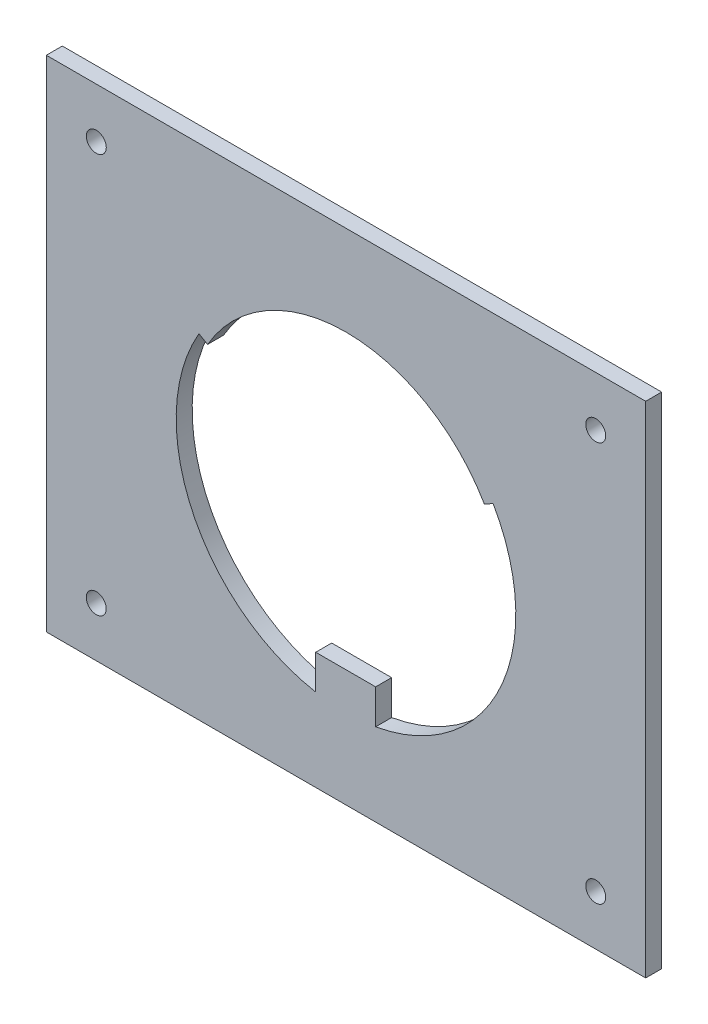
ISO-10303-21;
HEADER;
FILE_DESCRIPTION(('STEP AP214'),'2;1');
FILE_NAME('part.step','',(''),(''),'','','');
FILE_SCHEMA(('AUTOMOTIVE_DESIGN { 1 0 10303 214 1 1 1 1 }'));
ENDSEC;
DATA;
#1=APPLICATION_CONTEXT('core data for automotive mechanical design processes');
#2=APPLICATION_PROTOCOL_DEFINITION('international standard','automotive_design',2000,#1);
#3=PRODUCT_CONTEXT('',#1,'mechanical');
#4=PRODUCT('Part','Part','',(#3));
#5=PRODUCT_RELATED_PRODUCT_CATEGORY('part','',(#4));
#6=PRODUCT_DEFINITION_FORMATION('','',#4);
#7=PRODUCT_DEFINITION_CONTEXT('part definition',#1,'design');
#8=PRODUCT_DEFINITION('design','',#6,#7);
#9=PRODUCT_DEFINITION_SHAPE('','',#8);
#10=(LENGTH_UNIT() NAMED_UNIT(*) SI_UNIT(.MILLI.,.METRE.));
#11=(NAMED_UNIT(*) PLANE_ANGLE_UNIT() SI_UNIT($,.RADIAN.));
#12=(NAMED_UNIT(*) SI_UNIT($,.STERADIAN.) SOLID_ANGLE_UNIT());
#13=UNCERTAINTY_MEASURE_WITH_UNIT(LENGTH_MEASURE(1.E-05),#10,'distance_accuracy_value','');
#14=(GEOMETRIC_REPRESENTATION_CONTEXT(3) GLOBAL_UNCERTAINTY_ASSIGNED_CONTEXT((#13)) GLOBAL_UNIT_ASSIGNED_CONTEXT((#10,
#11,#12)) REPRESENTATION_CONTEXT('',''));
#15=CARTESIAN_POINT('',(0.,0.,0.));
#16=DIRECTION('',(0.,0.,1.));
#17=DIRECTION('',(1.,0.,0.));
#18=AXIS2_PLACEMENT_3D('',#15,#16,#17);
#19=CARTESIAN_POINT('',(0.,0.,1.6));
#20=DIRECTION('',(0.,0.,1.));
#21=DIRECTION('',(1.,0.,0.));
#22=AXIS2_PLACEMENT_3D('',#19,#20,#21);
#23=PLANE('',#22);
#24=CARTESIAN_POINT('',(27.1836166538104,-19.4518427269383,1.6));
#25=DIRECTION('',(0.,0.,1.));
#26=DIRECTION('',(1.,0.,0.));
#27=AXIS2_PLACEMENT_3D('',#24,#25,#26);
#28=CIRCLE('',#27,1.);
#29=CARTESIAN_POINT('',(28.1836166538105,-19.4518427269383,1.6));
#30=VERTEX_POINT('',#29);
#31=EDGE_CURVE('E313',#30,#30,#28,.T.);
#32=ORIENTED_EDGE('',*,*,#31,.F.);
#33=EDGE_LOOP('',(#32));
#34=FACE_BOUND('',#33,.T.);
#35=CARTESIAN_POINT('',(-22.8163833461895,20.5481572730617,1.6));
#36=DIRECTION('',(0.,0.,1.));
#37=DIRECTION('',(1.,0.,0.));
#38=AXIS2_PLACEMENT_3D('',#35,#36,#37);
#39=CIRCLE('',#38,1.);
#40=CARTESIAN_POINT('',(-21.8163833461895,20.5481572730617,1.6));
#41=VERTEX_POINT('',#40);
#42=EDGE_CURVE('E159',#41,#41,#39,.T.);
#43=ORIENTED_EDGE('',*,*,#42,.F.);
#44=EDGE_LOOP('',(#43));
#45=FACE_BOUND('',#44,.T.);
#46=DIRECTION('',(0.,1.,0.));
#47=VECTOR('',#46,1.);
#48=CARTESIAN_POINT('',(32.1836166538104,25.5481572730617,1.6));
#49=LINE('',#48,#47);
#50=CARTESIAN_POINT('',(32.1836166538104,-24.4518427269383,1.6));
#51=VERTEX_POINT('',#50);
#52=CARTESIAN_POINT('',(32.1836166538104,25.5481572730617,1.6));
#53=VERTEX_POINT('',#52);
#54=EDGE_CURVE('E189',#51,#53,#49,.T.);
#55=ORIENTED_EDGE('',*,*,#54,.T.);
#56=DIRECTION('',(-1.,0.,0.));
#57=VECTOR('',#56,1.);
#58=CARTESIAN_POINT('',(-27.8163833461895,25.5481572730617,1.6));
#59=LINE('',#58,#57);
#60=CARTESIAN_POINT('',(-27.8163833461895,25.5481572730617,1.6));
#61=VERTEX_POINT('',#60);
#62=EDGE_CURVE('E192',#53,#61,#59,.T.);
#63=ORIENTED_EDGE('',*,*,#62,.T.);
#64=DIRECTION('',(0.,-1.,0.));
#65=VECTOR('',#64,1.);
#66=CARTESIAN_POINT('',(-27.8163833461895,25.5481572730617,1.6));
#67=LINE('',#66,#65);
#68=CARTESIAN_POINT('',(-27.8163833461895,-24.4518427269383,1.6));
#69=VERTEX_POINT('',#68);
#70=EDGE_CURVE('E195',#61,#69,#67,.T.);
#71=ORIENTED_EDGE('',*,*,#70,.T.);
#72=DIRECTION('',(1.,0.,0.));
#73=VECTOR('',#72,1.);
#74=CARTESIAN_POINT('',(-27.8163833461895,-24.4518427269383,1.6));
#75=LINE('',#74,#73);
#76=EDGE_CURVE('E197',#69,#51,#75,.T.);
#77=ORIENTED_EDGE('',*,*,#76,.T.);
#78=EDGE_LOOP('',(#55,#63,#71,#77));
#79=FACE_BOUND('',#78,.T.);
#80=CARTESIAN_POINT('',(2.18361665381047,0.548157273061697,1.6));
#81=DIRECTION('',(0.,0.,1.));
#82=DIRECTION('',(1.,0.,0.));
#83=AXIS2_PLACEMENT_3D('',#80,#81,#82);
#84=CIRCLE('',#83,17.);
#85=CARTESIAN_POINT('',(5.15036070411573,-16.1909714300691,1.6));
#86=VERTEX_POINT('',#85);
#87=CARTESIAN_POINT('',(16.9060485181459,9.04815727306167,1.6));
#88=VERTEX_POINT('',#87);
#89=EDGE_CURVE('E129',#86,#88,#84,.T.);
#90=ORIENTED_EDGE('',*,*,#89,.F.);
#91=DIRECTION('',(0.,-1.,0.));
#92=VECTOR('',#91,1.);
#93=CARTESIAN_POINT('',(5.15036070411573,-12.7268427269383,1.6));
#94=LINE('',#93,#92);
#95=CARTESIAN_POINT('',(5.15036070411573,-12.7268427269383,1.6));
#96=VERTEX_POINT('',#95);
#97=EDGE_CURVE('E121',#96,#86,#94,.T.);
#98=ORIENTED_EDGE('',*,*,#97,.F.);
#99=DIRECTION('',(1.,0.,0.));
#100=VECTOR('',#99,1.);
#101=CARTESIAN_POINT('',(-0.84963929588427,-12.7268427269383,1.6));
#102=LINE('',#101,#100);
#103=CARTESIAN_POINT('',(-0.84963929588427,-12.7268427269383,1.6));
#104=VERTEX_POINT('',#103);
#105=EDGE_CURVE('E156',#104,#96,#102,.T.);
#106=ORIENTED_EDGE('',*,*,#105,.F.);
#107=DIRECTION('',(0.,1.,0.));
#108=VECTOR('',#107,1.);
#109=CARTESIAN_POINT('',(-0.84963929588427,-12.7268427269383,1.6));
#110=LINE('',#109,#108);
#111=CARTESIAN_POINT('',(-0.84963929588427,-16.1790468670103,1.6));
#112=VERTEX_POINT('',#111);
#113=EDGE_CURVE('E154',#112,#104,#110,.T.);
#114=ORIENTED_EDGE('',*,*,#113,.F.);
#115=CARTESIAN_POINT('',(2.18361665381047,0.548157273061699,1.6));
#116=DIRECTION('',(0.,0.,1.));
#117=DIRECTION('',(1.,0.,0.));
#118=AXIS2_PLACEMENT_3D('',#115,#116,#117);
#119=CIRCLE('',#118,17.);
#120=CARTESIAN_POINT('',(-12.538815210525,9.04815727306166,1.6));
#121=VERTEX_POINT('',#120);
#122=EDGE_CURVE('E152',#121,#112,#119,.T.);
#123=ORIENTED_EDGE('',*,*,#122,.F.);
#124=DIRECTION('',(-0.866025403784439,0.499999999999999,0.));
#125=VECTOR('',#124,1.);
#126=CARTESIAN_POINT('',(-11.6727898067406,8.54815727306167,1.6));
#127=LINE('',#126,#125);
#128=CARTESIAN_POINT('',(-11.6727898067406,8.54815727306167,1.6));
#129=VERTEX_POINT('',#128);
#130=EDGE_CURVE('E150',#129,#121,#127,.T.);
#131=ORIENTED_EDGE('',*,*,#130,.F.);
#132=CARTESIAN_POINT('',(2.18361665381045,0.548157273061695,1.6));
#133=DIRECTION('',(0.,0.,1.));
#134=DIRECTION('',(1.,0.,0.));
#135=AXIS2_PLACEMENT_3D('',#132,#133,#134);
#136=CIRCLE('',#135,16.);
#137=CARTESIAN_POINT('',(16.0400231143615,8.54815727306166,1.6));
#138=VERTEX_POINT('',#137);
#139=EDGE_CURVE('E145',#138,#129,#136,.T.);
#140=ORIENTED_EDGE('',*,*,#139,.F.);
#141=DIRECTION('',(-0.866025403784438,-0.500000000000002,0.));
#142=VECTOR('',#141,1.);
#143=CARTESIAN_POINT('',(16.9060485181459,9.04815727306167,1.6));
#144=LINE('',#143,#142);
#145=EDGE_CURVE('E143',#88,#138,#144,.T.);
#146=ORIENTED_EDGE('',*,*,#145,.F.);
#147=EDGE_LOOP('',(#90,#98,#106,#114,#123,#131,#140,#146));
#148=FACE_BOUND('',#147,.T.);
#149=CARTESIAN_POINT('',(27.1836166538104,20.5481572730617,1.6));
#150=DIRECTION('',(0.,0.,1.));
#151=DIRECTION('',(-1.,0.,0.));
#152=AXIS2_PLACEMENT_3D('',#149,#150,#151);
#153=CIRCLE('',#152,1.);
#154=CARTESIAN_POINT('',(26.1836166538104,20.5481572730617,1.6));
#155=VERTEX_POINT('',#154);
#156=EDGE_CURVE('E319',#155,#155,#153,.T.);
#157=ORIENTED_EDGE('',*,*,#156,.F.);
#158=EDGE_LOOP('',(#157));
#159=FACE_BOUND('',#158,.T.);
#160=CARTESIAN_POINT('',(-22.8163833461895,-19.4518427269383,1.6));
#161=DIRECTION('',(0.,0.,1.));
#162=DIRECTION('',(-1.,0.,0.));
#163=AXIS2_PLACEMENT_3D('',#160,#161,#162);
#164=CIRCLE('',#163,1.);
#165=CARTESIAN_POINT('',(-23.8163833461895,-19.4518427269383,1.6));
#166=VERTEX_POINT('',#165);
#167=EDGE_CURVE('E304',#166,#166,#164,.T.);
#168=ORIENTED_EDGE('',*,*,#167,.F.);
#169=EDGE_LOOP('',(#168));
#170=FACE_BOUND('',#169,.T.);
#171=ADVANCED_FACE('F32',(#34,#45,#79,#148,#159,#170),#23,.T.);
#172=CARTESIAN_POINT('',(0.,0.,0.));
#173=DIRECTION('',(0.,0.,1.));
#174=DIRECTION('',(1.,0.,0.));
#175=AXIS2_PLACEMENT_3D('',#172,#173,#174);
#176=PLANE('',#175);
#177=DIRECTION('',(0.,1.,0.));
#178=VECTOR('',#177,1.);
#179=CARTESIAN_POINT('',(32.1836166538104,25.5481572730617,0.));
#180=LINE('',#179,#178);
#181=CARTESIAN_POINT('',(32.1836166538104,-24.4518427269383,0.));
#182=VERTEX_POINT('',#181);
#183=CARTESIAN_POINT('',(32.1836166538104,25.5481572730617,0.));
#184=VERTEX_POINT('',#183);
#185=EDGE_CURVE('E137',#182,#184,#180,.T.);
#186=ORIENTED_EDGE('',*,*,#185,.F.);
#187=DIRECTION('',(1.,0.,0.));
#188=VECTOR('',#187,1.);
#189=CARTESIAN_POINT('',(-27.8163833461895,-24.4518427269383,0.));
#190=LINE('',#189,#188);
#191=CARTESIAN_POINT('',(-27.8163833461895,-24.4518427269383,0.));
#192=VERTEX_POINT('',#191);
#193=EDGE_CURVE('E193',#192,#182,#190,.T.);
#194=ORIENTED_EDGE('',*,*,#193,.F.);
#195=DIRECTION('',(0.,-1.,0.));
#196=VECTOR('',#195,1.);
#197=CARTESIAN_POINT('',(-27.8163833461895,25.5481572730617,0.));
#198=LINE('',#197,#196);
#199=CARTESIAN_POINT('',(-27.8163833461895,25.5481572730617,0.));
#200=VERTEX_POINT('',#199);
#201=EDGE_CURVE('E204',#200,#192,#198,.T.);
#202=ORIENTED_EDGE('',*,*,#201,.F.);
#203=DIRECTION('',(-1.,0.,0.));
#204=VECTOR('',#203,1.);
#205=CARTESIAN_POINT('',(-27.8163833461895,25.5481572730617,0.));
#206=LINE('',#205,#204);
#207=EDGE_CURVE('E202',#184,#200,#206,.T.);
#208=ORIENTED_EDGE('',*,*,#207,.F.);
#209=EDGE_LOOP('',(#186,#194,#202,#208));
#210=FACE_BOUND('',#209,.T.);
#211=DIRECTION('',(0.,-1.,0.));
#212=VECTOR('',#211,1.);
#213=CARTESIAN_POINT('',(5.15036070411573,-12.7268427269383,0.));
#214=LINE('',#213,#212);
#215=CARTESIAN_POINT('',(5.15036070411573,-12.7268427269383,0.));
#216=VERTEX_POINT('',#215);
#217=CARTESIAN_POINT('',(5.15036070411573,-16.1909714300691,0.));
#218=VERTEX_POINT('',#217);
#219=EDGE_CURVE('E55',#216,#218,#214,.T.);
#220=ORIENTED_EDGE('',*,*,#219,.T.);
#221=CARTESIAN_POINT('',(2.18361665381047,0.548157273061697,0.));
#222=DIRECTION('',(0.,0.,1.));
#223=DIRECTION('',(1.,0.,0.));
#224=AXIS2_PLACEMENT_3D('',#221,#222,#223);
#225=CIRCLE('',#224,17.);
#226=CARTESIAN_POINT('',(16.9060485181459,9.04815727306167,0.));
#227=VERTEX_POINT('',#226);
#228=EDGE_CURVE('E136',#218,#227,#225,.T.);
#229=ORIENTED_EDGE('',*,*,#228,.T.);
#230=DIRECTION('',(-0.866025403784438,-0.500000000000002,0.));
#231=VECTOR('',#230,1.);
#232=CARTESIAN_POINT('',(16.9060485181459,9.04815727306167,0.));
#233=LINE('',#232,#231);
#234=CARTESIAN_POINT('',(16.0400231143615,8.54815727306166,0.));
#235=VERTEX_POINT('',#234);
#236=EDGE_CURVE('E161',#227,#235,#233,.T.);
#237=ORIENTED_EDGE('',*,*,#236,.T.);
#238=CARTESIAN_POINT('',(2.18361665381045,0.548157273061695,0.));
#239=DIRECTION('',(0.,0.,1.));
#240=DIRECTION('',(1.,0.,0.));
#241=AXIS2_PLACEMENT_3D('',#238,#239,#240);
#242=CIRCLE('',#241,16.);
#243=CARTESIAN_POINT('',(-11.6727898067406,8.54815727306167,0.));
#244=VERTEX_POINT('',#243);
#245=EDGE_CURVE('E164',#235,#244,#242,.T.);
#246=ORIENTED_EDGE('',*,*,#245,.T.);
#247=DIRECTION('',(-0.866025403784439,0.499999999999999,0.));
#248=VECTOR('',#247,1.);
#249=CARTESIAN_POINT('',(-11.6727898067406,8.54815727306167,0.));
#250=LINE('',#249,#248);
#251=CARTESIAN_POINT('',(-12.538815210525,9.04815727306166,0.));
#252=VERTEX_POINT('',#251);
#253=EDGE_CURVE('E167',#244,#252,#250,.T.);
#254=ORIENTED_EDGE('',*,*,#253,.T.);
#255=CARTESIAN_POINT('',(2.18361665381047,0.548157273061699,0.));
#256=DIRECTION('',(0.,0.,1.));
#257=DIRECTION('',(1.,0.,0.));
#258=AXIS2_PLACEMENT_3D('',#255,#256,#257);
#259=CIRCLE('',#258,17.);
#260=CARTESIAN_POINT('',(-0.84963929588427,-16.1790468670103,0.));
#261=VERTEX_POINT('',#260);
#262=EDGE_CURVE('E170',#252,#261,#259,.T.);
#263=ORIENTED_EDGE('',*,*,#262,.T.);
#264=DIRECTION('',(0.,1.,0.));
#265=VECTOR('',#264,1.);
#266=CARTESIAN_POINT('',(-0.84963929588427,-12.7268427269383,0.));
#267=LINE('',#266,#265);
#268=CARTESIAN_POINT('',(-0.84963929588427,-12.7268427269383,0.));
#269=VERTEX_POINT('',#268);
#270=EDGE_CURVE('E173',#261,#269,#267,.T.);
#271=ORIENTED_EDGE('',*,*,#270,.T.);
#272=DIRECTION('',(1.,0.,0.));
#273=VECTOR('',#272,1.);
#274=CARTESIAN_POINT('',(-0.84963929588427,-12.7268427269383,0.));
#275=LINE('',#274,#273);
#276=EDGE_CURVE('E130',#269,#216,#275,.T.);
#277=ORIENTED_EDGE('',*,*,#276,.T.);
#278=EDGE_LOOP('',(#220,#229,#237,#246,#254,#263,#271,#277));
#279=FACE_BOUND('',#278,.T.);
#280=CARTESIAN_POINT('',(-22.8163833461895,20.5481572730617,0.));
#281=DIRECTION('',(0.,0.,1.));
#282=DIRECTION('',(1.,0.,0.));
#283=AXIS2_PLACEMENT_3D('',#280,#281,#282);
#284=CIRCLE('',#283,1.);
#285=CARTESIAN_POINT('',(-21.8163833461895,20.5481572730617,0.));
#286=VERTEX_POINT('',#285);
#287=EDGE_CURVE('E322',#286,#286,#284,.T.);
#288=ORIENTED_EDGE('',*,*,#287,.T.);
#289=EDGE_LOOP('',(#288));
#290=FACE_BOUND('',#289,.T.);
#291=CARTESIAN_POINT('',(27.1836166538104,20.5481572730617,0.));
#292=DIRECTION('',(0.,0.,1.));
#293=DIRECTION('',(-1.,0.,0.));
#294=AXIS2_PLACEMENT_3D('',#291,#292,#293);
#295=CIRCLE('',#294,1.);
#296=CARTESIAN_POINT('',(26.1836166538104,20.5481572730617,0.));
#297=VERTEX_POINT('',#296);
#298=EDGE_CURVE('E316',#297,#297,#295,.T.);
#299=ORIENTED_EDGE('',*,*,#298,.T.);
#300=EDGE_LOOP('',(#299));
#301=FACE_BOUND('',#300,.T.);
#302=CARTESIAN_POINT('',(27.1836166538104,-19.4518427269383,0.));
#303=DIRECTION('',(0.,0.,1.));
#304=DIRECTION('',(1.,0.,0.));
#305=AXIS2_PLACEMENT_3D('',#302,#303,#304);
#306=CIRCLE('',#305,1.);
#307=CARTESIAN_POINT('',(28.1836166538105,-19.4518427269383,0.));
#308=VERTEX_POINT('',#307);
#309=EDGE_CURVE('E310',#308,#308,#306,.T.);
#310=ORIENTED_EDGE('',*,*,#309,.T.);
#311=EDGE_LOOP('',(#310));
#312=FACE_BOUND('',#311,.T.);
#313=CARTESIAN_POINT('',(-22.8163833461895,-19.4518427269383,0.));
#314=DIRECTION('',(0.,0.,1.));
#315=DIRECTION('',(-1.,0.,0.));
#316=AXIS2_PLACEMENT_3D('',#313,#314,#315);
#317=CIRCLE('',#316,1.);
#318=CARTESIAN_POINT('',(-23.8163833461895,-19.4518427269383,0.));
#319=VERTEX_POINT('',#318);
#320=EDGE_CURVE('E307',#319,#319,#317,.T.);
#321=ORIENTED_EDGE('',*,*,#320,.T.);
#322=EDGE_LOOP('',(#321));
#323=FACE_BOUND('',#322,.T.);
#324=ADVANCED_FACE('F222',(#210,#279,#290,#301,#312,#323),#176,.F.);
#325=CARTESIAN_POINT('',(32.1836166538104,25.5481572730617,1.6));
#326=DIRECTION('',(-1.,0.,0.));
#327=DIRECTION('',(0.,0.,1.));
#328=AXIS2_PLACEMENT_3D('',#325,#326,#327);
#329=PLANE('',#328);
#330=ORIENTED_EDGE('',*,*,#185,.T.);
#331=DIRECTION('',(0.,0.,-1.));
#332=VECTOR('',#331,1.);
#333=CARTESIAN_POINT('',(32.1836166538104,25.5481572730617,1.6));
#334=LINE('',#333,#332);
#335=EDGE_CURVE('E11',#53,#184,#334,.T.);
#336=ORIENTED_EDGE('',*,*,#335,.F.);
#337=ORIENTED_EDGE('',*,*,#54,.F.);
#338=DIRECTION('',(0.,0.,-1.));
#339=VECTOR('',#338,1.);
#340=CARTESIAN_POINT('',(32.1836166538104,-24.4518427269383,1.6));
#341=LINE('',#340,#339);
#342=EDGE_CURVE('E199',#51,#182,#341,.T.);
#343=ORIENTED_EDGE('',*,*,#342,.T.);
#344=EDGE_LOOP('',(#330,#336,#337,#343));
#345=FACE_BOUND('',#344,.T.);
#346=ADVANCED_FACE('F34',(#345),#329,.F.);
#347=CARTESIAN_POINT('',(-27.8163833461895,25.5481572730617,1.6));
#348=DIRECTION('',(0.,-1.,0.));
#349=DIRECTION('',(0.,0.,-1.));
#350=AXIS2_PLACEMENT_3D('',#347,#348,#349);
#351=PLANE('',#350);
#352=ORIENTED_EDGE('',*,*,#207,.T.);
#353=DIRECTION('',(0.,0.,-1.));
#354=VECTOR('',#353,1.);
#355=CARTESIAN_POINT('',(-27.8163833461895,25.5481572730617,1.6));
#356=LINE('',#355,#354);
#357=EDGE_CURVE('E40',#61,#200,#356,.T.);
#358=ORIENTED_EDGE('',*,*,#357,.F.);
#359=ORIENTED_EDGE('',*,*,#62,.F.);
#360=ORIENTED_EDGE('',*,*,#335,.T.);
#361=EDGE_LOOP('',(#352,#358,#359,#360));
#362=FACE_BOUND('',#361,.T.);
#363=ADVANCED_FACE('F232',(#362),#351,.F.);
#364=CARTESIAN_POINT('',(-27.8163833461895,25.5481572730617,1.6));
#365=DIRECTION('',(1.,0.,0.));
#366=DIRECTION('',(0.,1.,0.));
#367=AXIS2_PLACEMENT_3D('',#364,#365,#366);
#368=PLANE('',#367);
#369=ORIENTED_EDGE('',*,*,#201,.T.);
#370=DIRECTION('',(0.,0.,-1.));
#371=VECTOR('',#370,1.);
#372=CARTESIAN_POINT('',(-27.8163833461895,-24.4518427269383,1.6));
#373=LINE('',#372,#371);
#374=EDGE_CURVE('E209',#69,#192,#373,.T.);
#375=ORIENTED_EDGE('',*,*,#374,.F.);
#376=ORIENTED_EDGE('',*,*,#70,.F.);
#377=ORIENTED_EDGE('',*,*,#357,.T.);
#378=EDGE_LOOP('',(#369,#375,#376,#377));
#379=FACE_BOUND('',#378,.T.);
#380=ADVANCED_FACE('F216',(#379),#368,.F.);
#381=CARTESIAN_POINT('',(-27.8163833461895,-24.4518427269383,1.6));
#382=DIRECTION('',(0.,1.,0.));
#383=DIRECTION('',(0.,0.,1.));
#384=AXIS2_PLACEMENT_3D('',#381,#382,#383);
#385=PLANE('',#384);
#386=ORIENTED_EDGE('',*,*,#193,.T.);
#387=ORIENTED_EDGE('',*,*,#342,.F.);
#388=ORIENTED_EDGE('',*,*,#76,.F.);
#389=ORIENTED_EDGE('',*,*,#374,.T.);
#390=EDGE_LOOP('',(#386,#387,#388,#389));
#391=FACE_BOUND('',#390,.T.);
#392=ADVANCED_FACE('F226',(#391),#385,.F.);
#393=CARTESIAN_POINT('',(5.15036070411573,-12.7268427269383,1.6));
#394=DIRECTION('',(1.,0.,0.));
#395=DIRECTION('',(0.,0.,-1.));
#396=AXIS2_PLACEMENT_3D('',#393,#394,#395);
#397=PLANE('',#396);
#398=ORIENTED_EDGE('',*,*,#219,.F.);
#399=DIRECTION('',(0.,0.,-1.));
#400=VECTOR('',#399,1.);
#401=CARTESIAN_POINT('',(5.15036070411573,-12.7268427269383,1.6));
#402=LINE('',#401,#400);
#403=EDGE_CURVE('E125',#96,#216,#402,.T.);
#404=ORIENTED_EDGE('',*,*,#403,.F.);
#405=ORIENTED_EDGE('',*,*,#97,.T.);
#406=DIRECTION('',(0.,0.,-1.));
#407=VECTOR('',#406,1.);
#408=CARTESIAN_POINT('',(5.15036070411573,-16.1909714300691,1.6));
#409=LINE('',#408,#407);
#410=EDGE_CURVE('E124',#86,#218,#409,.T.);
#411=ORIENTED_EDGE('',*,*,#410,.T.);
#412=EDGE_LOOP('',(#398,#404,#405,#411));
#413=FACE_BOUND('',#412,.T.);
#414=ADVANCED_FACE('F123',(#413),#397,.T.);
#415=CARTESIAN_POINT('',(2.18361665381047,0.548157273061697,1.6));
#416=DIRECTION('',(0.,0.,-1.));
#417=DIRECTION('',(-1.,0.,0.));
#418=AXIS2_PLACEMENT_3D('',#415,#416,#417);
#419=CYLINDRICAL_SURFACE('',#418,17.);
#420=ORIENTED_EDGE('',*,*,#228,.F.);
#421=ORIENTED_EDGE('',*,*,#410,.F.);
#422=ORIENTED_EDGE('',*,*,#89,.T.);
#423=DIRECTION('',(0.,0.,-1.));
#424=VECTOR('',#423,1.);
#425=CARTESIAN_POINT('',(16.9060485181459,9.04815727306167,1.6));
#426=LINE('',#425,#424);
#427=EDGE_CURVE('E138',#88,#227,#426,.T.);
#428=ORIENTED_EDGE('',*,*,#427,.T.);
#429=EDGE_LOOP('',(#420,#421,#422,#428));
#430=FACE_BOUND('',#429,.T.);
#431=ADVANCED_FACE('F133',(#430),#419,.F.);
#432=CARTESIAN_POINT('',(16.9060485181459,9.04815727306167,1.6));
#433=DIRECTION('',(0.500000000000002,-0.866025403784438,0.));
#434=DIRECTION('',(0.866025403784438,0.500000000000002,0.));
#435=AXIS2_PLACEMENT_3D('',#432,#433,#434);
#436=PLANE('',#435);
#437=ORIENTED_EDGE('',*,*,#236,.F.);
#438=ORIENTED_EDGE('',*,*,#427,.F.);
#439=ORIENTED_EDGE('',*,*,#145,.T.);
#440=DIRECTION('',(0.,0.,-1.));
#441=VECTOR('',#440,1.);
#442=CARTESIAN_POINT('',(16.0400231143615,8.54815727306166,1.6));
#443=LINE('',#442,#441);
#444=EDGE_CURVE('E186',#138,#235,#443,.T.);
#445=ORIENTED_EDGE('',*,*,#444,.T.);
#446=EDGE_LOOP('',(#437,#438,#439,#445));
#447=FACE_BOUND('',#446,.T.);
#448=ADVANCED_FACE('F258',(#447),#436,.T.);
#449=CARTESIAN_POINT('',(2.18361665381045,0.548157273061695,1.6));
#450=DIRECTION('',(0.,0.,-1.));
#451=DIRECTION('',(-1.,0.,0.));
#452=AXIS2_PLACEMENT_3D('',#449,#450,#451);
#453=CYLINDRICAL_SURFACE('',#452,16.);
#454=ORIENTED_EDGE('',*,*,#245,.F.);
#455=ORIENTED_EDGE('',*,*,#444,.F.);
#456=ORIENTED_EDGE('',*,*,#139,.T.);
#457=DIRECTION('',(0.,0.,-1.));
#458=VECTOR('',#457,1.);
#459=CARTESIAN_POINT('',(-11.6727898067406,8.54815727306167,1.6));
#460=LINE('',#459,#458);
#461=EDGE_CURVE('E184',#129,#244,#460,.T.);
#462=ORIENTED_EDGE('',*,*,#461,.T.);
#463=EDGE_LOOP('',(#454,#455,#456,#462));
#464=FACE_BOUND('',#463,.T.);
#465=ADVANCED_FACE('F262',(#464),#453,.F.);
#466=CARTESIAN_POINT('',(-11.6727898067406,8.54815727306167,1.6));
#467=DIRECTION('',(-0.499999999999999,-0.866025403784439,0.));
#468=DIRECTION('',(0.866025403784439,-0.499999999999999,0.));
#469=AXIS2_PLACEMENT_3D('',#466,#467,#468);
#470=PLANE('',#469);
#471=ORIENTED_EDGE('',*,*,#253,.F.);
#472=ORIENTED_EDGE('',*,*,#461,.F.);
#473=ORIENTED_EDGE('',*,*,#130,.T.);
#474=DIRECTION('',(0.,0.,-1.));
#475=VECTOR('',#474,1.);
#476=CARTESIAN_POINT('',(-12.538815210525,9.04815727306166,1.6));
#477=LINE('',#476,#475);
#478=EDGE_CURVE('E182',#121,#252,#477,.T.);
#479=ORIENTED_EDGE('',*,*,#478,.T.);
#480=EDGE_LOOP('',(#471,#472,#473,#479));
#481=FACE_BOUND('',#480,.T.);
#482=ADVANCED_FACE('F268',(#481),#470,.T.);
#483=CARTESIAN_POINT('',(2.18361665381047,0.548157273061699,1.6));
#484=DIRECTION('',(0.,0.,-1.));
#485=DIRECTION('',(-1.,0.,0.));
#486=AXIS2_PLACEMENT_3D('',#483,#484,#485);
#487=CYLINDRICAL_SURFACE('',#486,17.);
#488=ORIENTED_EDGE('',*,*,#262,.F.);
#489=ORIENTED_EDGE('',*,*,#478,.F.);
#490=ORIENTED_EDGE('',*,*,#122,.T.);
#491=DIRECTION('',(0.,0.,-1.));
#492=VECTOR('',#491,1.);
#493=CARTESIAN_POINT('',(-0.84963929588427,-16.1790468670103,1.6));
#494=LINE('',#493,#492);
#495=EDGE_CURVE('E180',#112,#261,#494,.T.);
#496=ORIENTED_EDGE('',*,*,#495,.T.);
#497=EDGE_LOOP('',(#488,#489,#490,#496));
#498=FACE_BOUND('',#497,.T.);
#499=ADVANCED_FACE('F272',(#498),#487,.F.);
#500=CARTESIAN_POINT('',(-0.84963929588427,-12.7268427269383,1.6));
#501=DIRECTION('',(-1.,0.,0.));
#502=DIRECTION('',(0.,-1.,0.));
#503=AXIS2_PLACEMENT_3D('',#500,#501,#502);
#504=PLANE('',#503);
#505=ORIENTED_EDGE('',*,*,#270,.F.);
#506=ORIENTED_EDGE('',*,*,#495,.F.);
#507=ORIENTED_EDGE('',*,*,#113,.T.);
#508=DIRECTION('',(0.,0.,-1.));
#509=VECTOR('',#508,1.);
#510=CARTESIAN_POINT('',(-0.84963929588427,-12.7268427269383,1.6));
#511=LINE('',#510,#509);
#512=EDGE_CURVE('E47',#104,#269,#511,.T.);
#513=ORIENTED_EDGE('',*,*,#512,.T.);
#514=EDGE_LOOP('',(#505,#506,#507,#513));
#515=FACE_BOUND('',#514,.T.);
#516=ADVANCED_FACE('F276',(#515),#504,.T.);
#517=CARTESIAN_POINT('',(-0.84963929588427,-12.7268427269383,1.6));
#518=DIRECTION('',(0.,1.,0.));
#519=DIRECTION('',(-1.,0.,0.));
#520=AXIS2_PLACEMENT_3D('',#517,#518,#519);
#521=PLANE('',#520);
#522=ORIENTED_EDGE('',*,*,#276,.F.);
#523=ORIENTED_EDGE('',*,*,#512,.F.);
#524=ORIENTED_EDGE('',*,*,#105,.T.);
#525=ORIENTED_EDGE('',*,*,#403,.T.);
#526=EDGE_LOOP('',(#522,#523,#524,#525));
#527=FACE_BOUND('',#526,.T.);
#528=ADVANCED_FACE('F280',(#527),#521,.T.);
#529=CARTESIAN_POINT('',(-22.8163833461895,20.5481572730617,1.6));
#530=DIRECTION('',(0.,0.,-1.));
#531=DIRECTION('',(-1.,0.,0.));
#532=AXIS2_PLACEMENT_3D('',#529,#530,#531);
#533=CYLINDRICAL_SURFACE('',#532,1.);
#534=ORIENTED_EDGE('',*,*,#42,.T.);
#535=EDGE_LOOP('',(#534));
#536=FACE_BOUND('',#535,.T.);
#537=ORIENTED_EDGE('',*,*,#287,.F.);
#538=EDGE_LOOP('',(#537));
#539=FACE_BOUND('',#538,.T.);
#540=ADVANCED_FACE('F284',(#536,#539),#533,.F.);
#541=CARTESIAN_POINT('',(27.1836166538104,20.5481572730617,1.6));
#542=DIRECTION('',(0.,0.,-1.));
#543=DIRECTION('',(-1.,0.,0.));
#544=AXIS2_PLACEMENT_3D('',#541,#542,#543);
#545=CYLINDRICAL_SURFACE('',#544,1.);
#546=ORIENTED_EDGE('',*,*,#156,.T.);
#547=EDGE_LOOP('',(#546));
#548=FACE_BOUND('',#547,.T.);
#549=ORIENTED_EDGE('',*,*,#298,.F.);
#550=EDGE_LOOP('',(#549));
#551=FACE_BOUND('',#550,.T.);
#552=ADVANCED_FACE('F287',(#548,#551),#545,.F.);
#553=CARTESIAN_POINT('',(27.1836166538104,-19.4518427269383,1.6));
#554=DIRECTION('',(0.,0.,-1.));
#555=DIRECTION('',(-1.,0.,0.));
#556=AXIS2_PLACEMENT_3D('',#553,#554,#555);
#557=CYLINDRICAL_SURFACE('',#556,1.);
#558=ORIENTED_EDGE('',*,*,#31,.T.);
#559=EDGE_LOOP('',(#558));
#560=FACE_BOUND('',#559,.T.);
#561=ORIENTED_EDGE('',*,*,#309,.F.);
#562=EDGE_LOOP('',(#561));
#563=FACE_BOUND('',#562,.T.);
#564=ADVANCED_FACE('F291',(#560,#563),#557,.F.);
#565=CARTESIAN_POINT('',(-22.8163833461895,-19.4518427269383,1.6));
#566=DIRECTION('',(0.,0.,-1.));
#567=DIRECTION('',(-1.,0.,0.));
#568=AXIS2_PLACEMENT_3D('',#565,#566,#567);
#569=CYLINDRICAL_SURFACE('',#568,1.);
#570=ORIENTED_EDGE('',*,*,#167,.T.);
#571=EDGE_LOOP('',(#570));
#572=FACE_BOUND('',#571,.T.);
#573=ORIENTED_EDGE('',*,*,#320,.F.);
#574=EDGE_LOOP('',(#573));
#575=FACE_BOUND('',#574,.T.);
#576=ADVANCED_FACE('F295',(#572,#575),#569,.F.);
#577=CLOSED_SHELL('',(#171,#324,#346,#363,#380,#392,#414,#431,#448,#465,#482,#499,#516,#528,
#540,#552,#564,#576));
#578=MANIFOLD_SOLID_BREP('B2',#577);
#579=ADVANCED_BREP_SHAPE_REPRESENTATION('',(#18,#578),#14);
#580=SHAPE_DEFINITION_REPRESENTATION(#9,#579);
ENDSEC;
END-ISO-10303-21;
